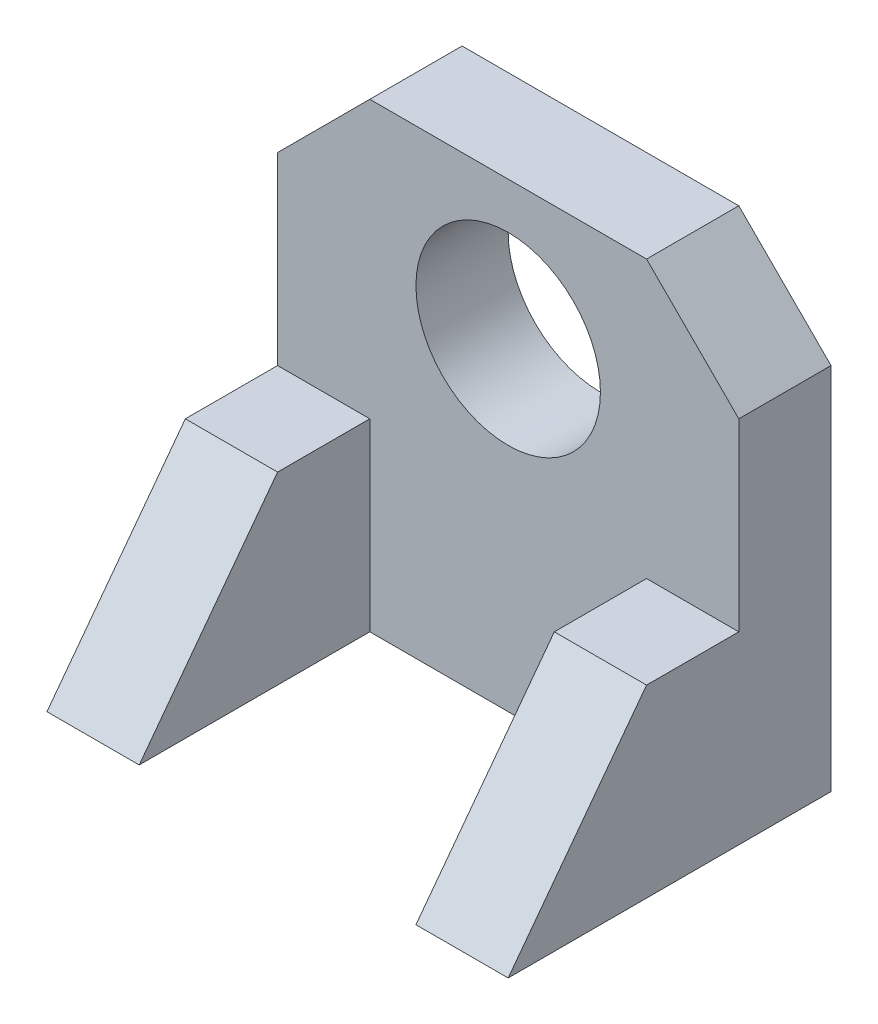
ISO-10303-21;
HEADER;
FILE_DESCRIPTION(('STEP AP214'),'2;1');
FILE_NAME('part.step','',(''),(''),'','','');
FILE_SCHEMA(('AUTOMOTIVE_DESIGN { 1 0 10303 214 1 1 1 1 }'));
ENDSEC;
DATA;
#1=APPLICATION_CONTEXT('core data for automotive mechanical design processes');
#2=APPLICATION_PROTOCOL_DEFINITION('international standard','automotive_design',2000,#1);
#3=PRODUCT_CONTEXT('',#1,'mechanical');
#4=PRODUCT('Part','Part','',(#3));
#5=PRODUCT_RELATED_PRODUCT_CATEGORY('part','',(#4));
#6=PRODUCT_DEFINITION_FORMATION('','',#4);
#7=PRODUCT_DEFINITION_CONTEXT('part definition',#1,'design');
#8=PRODUCT_DEFINITION('design','',#6,#7);
#9=PRODUCT_DEFINITION_SHAPE('','',#8);
#10=(LENGTH_UNIT() NAMED_UNIT(*) SI_UNIT(.MILLI.,.METRE.));
#11=(NAMED_UNIT(*) PLANE_ANGLE_UNIT() SI_UNIT($,.RADIAN.));
#12=(NAMED_UNIT(*) SI_UNIT($,.STERADIAN.) SOLID_ANGLE_UNIT());
#13=UNCERTAINTY_MEASURE_WITH_UNIT(LENGTH_MEASURE(1.E-05),#10,'distance_accuracy_value','');
#14=(GEOMETRIC_REPRESENTATION_CONTEXT(3) GLOBAL_UNCERTAINTY_ASSIGNED_CONTEXT((#13)) GLOBAL_UNIT_ASSIGNED_CONTEXT((#10,
#11,#12)) REPRESENTATION_CONTEXT('',''));
#15=CARTESIAN_POINT('',(0.,0.,0.));
#16=DIRECTION('',(0.,0.,1.));
#17=DIRECTION('',(1.,0.,0.));
#18=AXIS2_PLACEMENT_3D('',#15,#16,#17);
#19=CARTESIAN_POINT('',(0.,0.,10.));
#20=DIRECTION('',(0.,0.,-1.));
#21=DIRECTION('',(-1.,0.,0.));
#22=AXIS2_PLACEMENT_3D('',#19,#20,#21);
#23=PLANE('',#22);
#24=CARTESIAN_POINT('',(0.,35.,10.));
#25=DIRECTION('',(0.,0.,1.));
#26=DIRECTION('',(1.,0.,0.));
#27=AXIS2_PLACEMENT_3D('',#24,#25,#26);
#28=CIRCLE('',#27,10.);
#29=CARTESIAN_POINT('',(10.,35.,10.));
#30=VERTEX_POINT('',#29);
#31=EDGE_CURVE('E161',#30,#30,#28,.T.);
#32=ORIENTED_EDGE('',*,*,#31,.F.);
#33=EDGE_LOOP('',(#32));
#34=FACE_BOUND('',#33,.T.);
#35=DIRECTION('',(-0.707106781186547,-0.707106781186548,0.));
#36=VECTOR('',#35,1.);
#37=CARTESIAN_POINT('',(-25.,40.,10.));
#38=LINE('',#37,#36);
#39=CARTESIAN_POINT('',(-15.,50.,10.));
#40=VERTEX_POINT('',#39);
#41=CARTESIAN_POINT('',(-25.,40.,10.));
#42=VERTEX_POINT('',#41);
#43=EDGE_CURVE('E143',#40,#42,#38,.T.);
#44=ORIENTED_EDGE('',*,*,#43,.T.);
#45=DIRECTION('',(0.,-1.,0.));
#46=VECTOR('',#45,1.);
#47=CARTESIAN_POINT('',(-25.,0.,10.));
#48=LINE('',#47,#46);
#49=CARTESIAN_POINT('',(-25.,20.,10.));
#50=VERTEX_POINT('',#49);
#51=EDGE_CURVE('E139',#42,#50,#48,.T.);
#52=ORIENTED_EDGE('',*,*,#51,.T.);
#53=DIRECTION('',(1.,0.,0.));
#54=VECTOR('',#53,1.);
#55=CARTESIAN_POINT('',(-25.,20.,10.));
#56=LINE('',#55,#54);
#57=CARTESIAN_POINT('',(-15.,20.,10.));
#58=VERTEX_POINT('',#57);
#59=EDGE_CURVE('E124',#50,#58,#56,.T.);
#60=ORIENTED_EDGE('',*,*,#59,.T.);
#61=DIRECTION('',(0.,-1.,0.));
#62=VECTOR('',#61,1.);
#63=CARTESIAN_POINT('',(-15.,0.,10.));
#64=LINE('',#63,#62);
#65=CARTESIAN_POINT('',(-15.,0.,10.));
#66=VERTEX_POINT('',#65);
#67=EDGE_CURVE('E388',#58,#66,#64,.T.);
#68=ORIENTED_EDGE('',*,*,#67,.T.);
#69=DIRECTION('',(1.,0.,0.));
#70=VECTOR('',#69,1.);
#71=CARTESIAN_POINT('',(-25.,0.,10.));
#72=LINE('',#71,#70);
#73=CARTESIAN_POINT('',(15.,0.,10.));
#74=VERTEX_POINT('',#73);
#75=EDGE_CURVE('E145',#66,#74,#72,.T.);
#76=ORIENTED_EDGE('',*,*,#75,.T.);
#77=DIRECTION('',(0.,-1.,0.));
#78=VECTOR('',#77,1.);
#79=CARTESIAN_POINT('',(15.,0.,10.));
#80=LINE('',#79,#78);
#81=CARTESIAN_POINT('',(15.,20.,10.));
#82=VERTEX_POINT('',#81);
#83=EDGE_CURVE('E56',#82,#74,#80,.T.);
#84=ORIENTED_EDGE('',*,*,#83,.F.);
#85=DIRECTION('',(-1.,0.,0.));
#86=VECTOR('',#85,1.);
#87=CARTESIAN_POINT('',(25.,20.,10.));
#88=LINE('',#87,#86);
#89=CARTESIAN_POINT('',(25.,20.,10.));
#90=VERTEX_POINT('',#89);
#91=EDGE_CURVE('E217',#90,#82,#88,.T.);
#92=ORIENTED_EDGE('',*,*,#91,.F.);
#93=DIRECTION('',(0.,1.,0.));
#94=VECTOR('',#93,1.);
#95=CARTESIAN_POINT('',(25.,40.,10.));
#96=LINE('',#95,#94);
#97=CARTESIAN_POINT('',(25.,40.,10.));
#98=VERTEX_POINT('',#97);
#99=EDGE_CURVE('E147',#90,#98,#96,.T.);
#100=ORIENTED_EDGE('',*,*,#99,.T.);
#101=DIRECTION('',(-0.707106781186547,0.707106781186548,0.));
#102=VECTOR('',#101,1.);
#103=CARTESIAN_POINT('',(15.,50.,10.));
#104=LINE('',#103,#102);
#105=CARTESIAN_POINT('',(15.,50.,10.));
#106=VERTEX_POINT('',#105);
#107=EDGE_CURVE('E154',#98,#106,#104,.T.);
#108=ORIENTED_EDGE('',*,*,#107,.T.);
#109=DIRECTION('',(-1.,0.,0.));
#110=VECTOR('',#109,1.);
#111=CARTESIAN_POINT('',(-15.,50.,10.));
#112=LINE('',#111,#110);
#113=EDGE_CURVE('E149',#106,#40,#112,.T.);
#114=ORIENTED_EDGE('',*,*,#113,.T.);
#115=EDGE_LOOP('',(#44,#52,#60,#68,#76,#84,#92,#100,#108,#114));
#116=FACE_BOUND('',#115,.T.);
#117=ADVANCED_FACE('F33',(#34,#116),#23,.F.);
#118=CARTESIAN_POINT('',(0.,0.,0.));
#119=DIRECTION('',(0.,0.,-1.));
#120=DIRECTION('',(-1.,0.,0.));
#121=AXIS2_PLACEMENT_3D('',#118,#119,#120);
#122=PLANE('',#121);
#123=DIRECTION('',(0.,-1.,0.));
#124=VECTOR('',#123,1.);
#125=CARTESIAN_POINT('',(-25.,0.,0.));
#126=LINE('',#125,#124);
#127=CARTESIAN_POINT('',(-25.,40.,0.));
#128=VERTEX_POINT('',#127);
#129=CARTESIAN_POINT('',(-25.,0.,0.));
#130=VERTEX_POINT('',#129);
#131=EDGE_CURVE('E163',#128,#130,#126,.T.);
#132=ORIENTED_EDGE('',*,*,#131,.F.);
#133=DIRECTION('',(-0.707106781186547,-0.707106781186548,0.));
#134=VECTOR('',#133,1.);
#135=CARTESIAN_POINT('',(-25.,40.,0.));
#136=LINE('',#135,#134);
#137=CARTESIAN_POINT('',(-15.,50.,0.));
#138=VERTEX_POINT('',#137);
#139=EDGE_CURVE('E160',#138,#128,#136,.T.);
#140=ORIENTED_EDGE('',*,*,#139,.F.);
#141=DIRECTION('',(-1.,0.,0.));
#142=VECTOR('',#141,1.);
#143=CARTESIAN_POINT('',(-15.,50.,0.));
#144=LINE('',#143,#142);
#145=CARTESIAN_POINT('',(15.,50.,0.));
#146=VERTEX_POINT('',#145);
#147=EDGE_CURVE('E157',#146,#138,#144,.T.);
#148=ORIENTED_EDGE('',*,*,#147,.F.);
#149=DIRECTION('',(-0.707106781186547,0.707106781186548,0.));
#150=VECTOR('',#149,1.);
#151=CARTESIAN_POINT('',(15.,50.,0.));
#152=LINE('',#151,#150);
#153=CARTESIAN_POINT('',(25.,40.,0.));
#154=VERTEX_POINT('',#153);
#155=EDGE_CURVE('E169',#154,#146,#152,.T.);
#156=ORIENTED_EDGE('',*,*,#155,.F.);
#157=DIRECTION('',(0.,1.,0.));
#158=VECTOR('',#157,1.);
#159=CARTESIAN_POINT('',(25.,40.,0.));
#160=LINE('',#159,#158);
#161=CARTESIAN_POINT('',(25.,0.,0.));
#162=VERTEX_POINT('',#161);
#163=EDGE_CURVE('E167',#162,#154,#160,.T.);
#164=ORIENTED_EDGE('',*,*,#163,.F.);
#165=DIRECTION('',(1.,0.,0.));
#166=VECTOR('',#165,1.);
#167=CARTESIAN_POINT('',(-25.,0.,0.));
#168=LINE('',#167,#166);
#169=EDGE_CURVE('E165',#130,#162,#168,.T.);
#170=ORIENTED_EDGE('',*,*,#169,.F.);
#171=EDGE_LOOP('',(#132,#140,#148,#156,#164,#170));
#172=FACE_BOUND('',#171,.T.);
#173=CARTESIAN_POINT('',(0.,35.,0.));
#174=DIRECTION('',(0.,0.,1.));
#175=DIRECTION('',(1.,0.,0.));
#176=AXIS2_PLACEMENT_3D('',#173,#174,#175);
#177=CIRCLE('',#176,10.);
#178=CARTESIAN_POINT('',(10.,35.,0.));
#179=VERTEX_POINT('',#178);
#180=EDGE_CURVE('E225',#179,#179,#177,.T.);
#181=ORIENTED_EDGE('',*,*,#180,.T.);
#182=EDGE_LOOP('',(#181));
#183=FACE_BOUND('',#182,.T.);
#184=ADVANCED_FACE('F185',(#172,#183),#122,.T.);
#185=CARTESIAN_POINT('',(-15.,50.,10.));
#186=DIRECTION('',(0.,-1.,0.));
#187=DIRECTION('',(0.,0.,-1.));
#188=AXIS2_PLACEMENT_3D('',#185,#186,#187);
#189=PLANE('',#188);
#190=ORIENTED_EDGE('',*,*,#147,.T.);
#191=DIRECTION('',(0.,0.,-1.));
#192=VECTOR('',#191,1.);
#193=CARTESIAN_POINT('',(-15.,50.,10.));
#194=LINE('',#193,#192);
#195=EDGE_CURVE('E11',#40,#138,#194,.T.);
#196=ORIENTED_EDGE('',*,*,#195,.F.);
#197=ORIENTED_EDGE('',*,*,#113,.F.);
#198=DIRECTION('',(0.,0.,-1.));
#199=VECTOR('',#198,1.);
#200=CARTESIAN_POINT('',(15.,50.,10.));
#201=LINE('',#200,#199);
#202=EDGE_CURVE('E156',#106,#146,#201,.T.);
#203=ORIENTED_EDGE('',*,*,#202,.T.);
#204=EDGE_LOOP('',(#190,#196,#197,#203));
#205=FACE_BOUND('',#204,.T.);
#206=ADVANCED_FACE('F35',(#205),#189,.F.);
#207=CARTESIAN_POINT('',(-25.,40.,10.));
#208=DIRECTION('',(0.707106781186548,-0.707106781186547,0.));
#209=DIRECTION('',(0.707106781186547,0.707106781186548,0.));
#210=AXIS2_PLACEMENT_3D('',#207,#208,#209);
#211=PLANE('',#210);
#212=ORIENTED_EDGE('',*,*,#139,.T.);
#213=DIRECTION('',(0.,0.,-1.));
#214=VECTOR('',#213,1.);
#215=CARTESIAN_POINT('',(-25.,40.,10.));
#216=LINE('',#215,#214);
#217=EDGE_CURVE('E41',#42,#128,#216,.T.);
#218=ORIENTED_EDGE('',*,*,#217,.F.);
#219=ORIENTED_EDGE('',*,*,#43,.F.);
#220=ORIENTED_EDGE('',*,*,#195,.T.);
#221=EDGE_LOOP('',(#212,#218,#219,#220));
#222=FACE_BOUND('',#221,.T.);
#223=ADVANCED_FACE('F234',(#222),#211,.F.);
#224=CARTESIAN_POINT('',(-25.,0.,10.));
#225=DIRECTION('',(1.,0.,0.));
#226=DIRECTION('',(0.,0.,-1.));
#227=AXIS2_PLACEMENT_3D('',#224,#225,#226);
#228=PLANE('',#227);
#229=ORIENTED_EDGE('',*,*,#131,.T.);
#230=DIRECTION('',(0.,0.,-1.));
#231=VECTOR('',#230,1.);
#232=CARTESIAN_POINT('',(-25.,0.,10.));
#233=LINE('',#232,#231);
#234=CARTESIAN_POINT('',(-25.,0.,35.));
#235=VERTEX_POINT('',#234);
#236=EDGE_CURVE('E179',#235,#130,#233,.T.);
#237=ORIENTED_EDGE('',*,*,#236,.F.);
#238=DIRECTION('',(0.,-0.8,0.6));
#239=VECTOR('',#238,1.);
#240=CARTESIAN_POINT('',(-25.,0.,35.));
#241=LINE('',#240,#239);
#242=CARTESIAN_POINT('',(-25.,20.,20.));
#243=VERTEX_POINT('',#242);
#244=EDGE_CURVE('E132',#243,#235,#241,.T.);
#245=ORIENTED_EDGE('',*,*,#244,.F.);
#246=DIRECTION('',(0.,0.,1.));
#247=VECTOR('',#246,1.);
#248=CARTESIAN_POINT('',(-25.,20.,20.));
#249=LINE('',#248,#247);
#250=EDGE_CURVE('E127',#50,#243,#249,.T.);
#251=ORIENTED_EDGE('',*,*,#250,.F.);
#252=ORIENTED_EDGE('',*,*,#51,.F.);
#253=ORIENTED_EDGE('',*,*,#217,.T.);
#254=EDGE_LOOP('',(#229,#237,#245,#251,#252,#253));
#255=FACE_BOUND('',#254,.T.);
#256=ADVANCED_FACE('F137',(#255),#228,.F.);
#257=CARTESIAN_POINT('',(-25.,0.,10.));
#258=DIRECTION('',(0.,1.,0.));
#259=DIRECTION('',(0.,0.,1.));
#260=AXIS2_PLACEMENT_3D('',#257,#258,#259);
#261=PLANE('',#260);
#262=ORIENTED_EDGE('',*,*,#75,.F.);
#263=DIRECTION('',(0.,0.,-1.));
#264=VECTOR('',#263,1.);
#265=CARTESIAN_POINT('',(-15.,0.,10.));
#266=LINE('',#265,#264);
#267=CARTESIAN_POINT('',(-15.,0.,35.));
#268=VERTEX_POINT('',#267);
#269=EDGE_CURVE('E48',#268,#66,#266,.T.);
#270=ORIENTED_EDGE('',*,*,#269,.F.);
#271=DIRECTION('',(1.,0.,0.));
#272=VECTOR('',#271,1.);
#273=CARTESIAN_POINT('',(-25.,0.,35.));
#274=LINE('',#273,#272);
#275=EDGE_CURVE('E386',#235,#268,#274,.T.);
#276=ORIENTED_EDGE('',*,*,#275,.F.);
#277=ORIENTED_EDGE('',*,*,#236,.T.);
#278=ORIENTED_EDGE('',*,*,#169,.T.);
#279=DIRECTION('',(0.,0.,-1.));
#280=VECTOR('',#279,1.);
#281=CARTESIAN_POINT('',(25.,0.,10.));
#282=LINE('',#281,#280);
#283=CARTESIAN_POINT('',(25.,0.,35.));
#284=VERTEX_POINT('',#283);
#285=EDGE_CURVE('E176',#284,#162,#282,.T.);
#286=ORIENTED_EDGE('',*,*,#285,.F.);
#287=DIRECTION('',(-1.,0.,0.));
#288=VECTOR('',#287,1.);
#289=CARTESIAN_POINT('',(25.,0.,35.));
#290=LINE('',#289,#288);
#291=CARTESIAN_POINT('',(15.,0.,35.));
#292=VERTEX_POINT('',#291);
#293=EDGE_CURVE('E208',#284,#292,#290,.T.);
#294=ORIENTED_EDGE('',*,*,#293,.T.);
#295=DIRECTION('',(0.,0.,-1.));
#296=VECTOR('',#295,1.);
#297=CARTESIAN_POINT('',(15.,0.,10.));
#298=LINE('',#297,#296);
#299=EDGE_CURVE('E220',#292,#74,#298,.T.);
#300=ORIENTED_EDGE('',*,*,#299,.T.);
#301=EDGE_LOOP('',(#262,#270,#276,#277,#278,#286,#294,#300));
#302=FACE_BOUND('',#301,.T.);
#303=ADVANCED_FACE('F192',(#302),#261,.F.);
#304=CARTESIAN_POINT('',(25.,40.,10.));
#305=DIRECTION('',(-1.,0.,0.));
#306=DIRECTION('',(0.,-1.,0.));
#307=AXIS2_PLACEMENT_3D('',#304,#305,#306);
#308=PLANE('',#307);
#309=ORIENTED_EDGE('',*,*,#163,.T.);
#310=DIRECTION('',(0.,0.,-1.));
#311=VECTOR('',#310,1.);
#312=CARTESIAN_POINT('',(25.,40.,10.));
#313=LINE('',#312,#311);
#314=EDGE_CURVE('E173',#98,#154,#313,.T.);
#315=ORIENTED_EDGE('',*,*,#314,.F.);
#316=ORIENTED_EDGE('',*,*,#99,.F.);
#317=DIRECTION('',(0.,0.,1.));
#318=VECTOR('',#317,1.);
#319=CARTESIAN_POINT('',(25.,20.,20.));
#320=LINE('',#319,#318);
#321=CARTESIAN_POINT('',(25.,20.,20.));
#322=VERTEX_POINT('',#321);
#323=EDGE_CURVE('E204',#90,#322,#320,.T.);
#324=ORIENTED_EDGE('',*,*,#323,.T.);
#325=DIRECTION('',(0.,-0.8,0.6));
#326=VECTOR('',#325,1.);
#327=CARTESIAN_POINT('',(25.,0.,35.));
#328=LINE('',#327,#326);
#329=EDGE_CURVE('E200',#322,#284,#328,.T.);
#330=ORIENTED_EDGE('',*,*,#329,.T.);
#331=ORIENTED_EDGE('',*,*,#285,.T.);
#332=EDGE_LOOP('',(#309,#315,#316,#324,#330,#331));
#333=FACE_BOUND('',#332,.T.);
#334=ADVANCED_FACE('F197',(#333),#308,.F.);
#335=CARTESIAN_POINT('',(15.,50.,10.));
#336=DIRECTION('',(-0.707106781186548,-0.707106781186547,0.));
#337=DIRECTION('',(0.707106781186547,-0.707106781186548,0.));
#338=AXIS2_PLACEMENT_3D('',#335,#336,#337);
#339=PLANE('',#338);
#340=ORIENTED_EDGE('',*,*,#155,.T.);
#341=ORIENTED_EDGE('',*,*,#202,.F.);
#342=ORIENTED_EDGE('',*,*,#107,.F.);
#343=ORIENTED_EDGE('',*,*,#314,.T.);
#344=EDGE_LOOP('',(#340,#341,#342,#343));
#345=FACE_BOUND('',#344,.T.);
#346=ADVANCED_FACE('F253',(#345),#339,.F.);
#347=CARTESIAN_POINT('',(0.,35.,10.));
#348=DIRECTION('',(0.,0.,-1.));
#349=DIRECTION('',(-1.,0.,0.));
#350=AXIS2_PLACEMENT_3D('',#347,#348,#349);
#351=CYLINDRICAL_SURFACE('',#350,10.);
#352=ORIENTED_EDGE('',*,*,#31,.T.);
#353=EDGE_LOOP('',(#352));
#354=FACE_BOUND('',#353,.T.);
#355=ORIENTED_EDGE('',*,*,#180,.F.);
#356=EDGE_LOOP('',(#355));
#357=FACE_BOUND('',#356,.T.);
#358=ADVANCED_FACE('F250',(#354,#357),#351,.F.);
#359=CARTESIAN_POINT('',(15.,0.,0.));
#360=DIRECTION('',(1.,0.,0.));
#361=DIRECTION('',(0.,0.,-1.));
#362=AXIS2_PLACEMENT_3D('',#359,#360,#361);
#363=PLANE('',#362);
#364=DIRECTION('',(0.,0.,1.));
#365=VECTOR('',#364,1.);
#366=CARTESIAN_POINT('',(15.,20.,20.));
#367=LINE('',#366,#365);
#368=CARTESIAN_POINT('',(15.,20.,20.));
#369=VERTEX_POINT('',#368);
#370=EDGE_CURVE('E396',#82,#369,#367,.T.);
#371=ORIENTED_EDGE('',*,*,#370,.F.);
#372=ORIENTED_EDGE('',*,*,#83,.T.);
#373=ORIENTED_EDGE('',*,*,#299,.F.);
#374=DIRECTION('',(0.,-0.8,0.6));
#375=VECTOR('',#374,1.);
#376=CARTESIAN_POINT('',(15.,0.,35.));
#377=LINE('',#376,#375);
#378=EDGE_CURVE('E212',#369,#292,#377,.T.);
#379=ORIENTED_EDGE('',*,*,#378,.F.);
#380=EDGE_LOOP('',(#371,#372,#373,#379));
#381=FACE_BOUND('',#380,.T.);
#382=ADVANCED_FACE('F280',(#381),#363,.F.);
#383=CARTESIAN_POINT('',(25.,20.,20.));
#384=DIRECTION('',(0.,-1.,0.));
#385=DIRECTION('',(0.,0.,-1.));
#386=AXIS2_PLACEMENT_3D('',#383,#384,#385);
#387=PLANE('',#386);
#388=ORIENTED_EDGE('',*,*,#370,.T.);
#389=DIRECTION('',(-1.,0.,0.));
#390=VECTOR('',#389,1.);
#391=CARTESIAN_POINT('',(25.,20.,20.));
#392=LINE('',#391,#390);
#393=EDGE_CURVE('E215',#322,#369,#392,.T.);
#394=ORIENTED_EDGE('',*,*,#393,.F.);
#395=ORIENTED_EDGE('',*,*,#323,.F.);
#396=ORIENTED_EDGE('',*,*,#91,.T.);
#397=EDGE_LOOP('',(#388,#394,#395,#396));
#398=FACE_BOUND('',#397,.T.);
#399=ADVANCED_FACE('F286',(#398),#387,.F.);
#400=CARTESIAN_POINT('',(25.,0.,35.));
#401=DIRECTION('',(0.,-0.6,-0.8));
#402=DIRECTION('',(0.,0.8,-0.6));
#403=AXIS2_PLACEMENT_3D('',#400,#401,#402);
#404=PLANE('',#403);
#405=ORIENTED_EDGE('',*,*,#378,.T.);
#406=ORIENTED_EDGE('',*,*,#293,.F.);
#407=ORIENTED_EDGE('',*,*,#329,.F.);
#408=ORIENTED_EDGE('',*,*,#393,.T.);
#409=EDGE_LOOP('',(#405,#406,#407,#408));
#410=FACE_BOUND('',#409,.T.);
#411=ADVANCED_FACE('F210',(#410),#404,.F.);
#412=CARTESIAN_POINT('',(-15.,0.,0.));
#413=DIRECTION('',(1.,0.,0.));
#414=DIRECTION('',(0.,0.,-1.));
#415=AXIS2_PLACEMENT_3D('',#412,#413,#414);
#416=PLANE('',#415);
#417=ORIENTED_EDGE('',*,*,#67,.F.);
#418=DIRECTION('',(0.,0.,1.));
#419=VECTOR('',#418,1.);
#420=CARTESIAN_POINT('',(-15.,20.,20.));
#421=LINE('',#420,#419);
#422=CARTESIAN_POINT('',(-15.,20.,20.));
#423=VERTEX_POINT('',#422);
#424=EDGE_CURVE('E129',#58,#423,#421,.T.);
#425=ORIENTED_EDGE('',*,*,#424,.T.);
#426=DIRECTION('',(0.,-0.8,0.6));
#427=VECTOR('',#426,1.);
#428=CARTESIAN_POINT('',(-15.,0.,35.));
#429=LINE('',#428,#427);
#430=EDGE_CURVE('E385',#423,#268,#429,.T.);
#431=ORIENTED_EDGE('',*,*,#430,.T.);
#432=ORIENTED_EDGE('',*,*,#269,.T.);
#433=EDGE_LOOP('',(#417,#425,#431,#432));
#434=FACE_BOUND('',#433,.T.);
#435=ADVANCED_FACE('F300',(#434),#416,.T.);
#436=CARTESIAN_POINT('',(-25.,0.,35.));
#437=DIRECTION('',(0.,0.6,0.8));
#438=DIRECTION('',(0.,-0.8,0.6));
#439=AXIS2_PLACEMENT_3D('',#436,#437,#438);
#440=PLANE('',#439);
#441=ORIENTED_EDGE('',*,*,#430,.F.);
#442=DIRECTION('',(1.,0.,0.));
#443=VECTOR('',#442,1.);
#444=CARTESIAN_POINT('',(-25.,20.,20.));
#445=LINE('',#444,#443);
#446=EDGE_CURVE('E131',#243,#423,#445,.T.);
#447=ORIENTED_EDGE('',*,*,#446,.F.);
#448=ORIENTED_EDGE('',*,*,#244,.T.);
#449=ORIENTED_EDGE('',*,*,#275,.T.);
#450=EDGE_LOOP('',(#441,#447,#448,#449));
#451=FACE_BOUND('',#450,.T.);
#452=ADVANCED_FACE('F306',(#451),#440,.T.);
#453=CARTESIAN_POINT('',(-25.,20.,20.));
#454=DIRECTION('',(0.,1.,0.));
#455=DIRECTION('',(0.,0.,1.));
#456=AXIS2_PLACEMENT_3D('',#453,#454,#455);
#457=PLANE('',#456);
#458=ORIENTED_EDGE('',*,*,#424,.F.);
#459=ORIENTED_EDGE('',*,*,#59,.F.);
#460=ORIENTED_EDGE('',*,*,#250,.T.);
#461=ORIENTED_EDGE('',*,*,#446,.T.);
#462=EDGE_LOOP('',(#458,#459,#460,#461));
#463=FACE_BOUND('',#462,.T.);
#464=ADVANCED_FACE('F126',(#463),#457,.T.);
#465=CLOSED_SHELL('',(#117,#184,#206,#223,#256,#303,#334,#346,#358,#382,#399,#411,#435,#452,#464));
#466=MANIFOLD_SOLID_BREP('B2',#465);
#467=ADVANCED_BREP_SHAPE_REPRESENTATION('',(#18,#466),#14);
#468=SHAPE_DEFINITION_REPRESENTATION(#9,#467);
ENDSEC;
END-ISO-10303-21;
